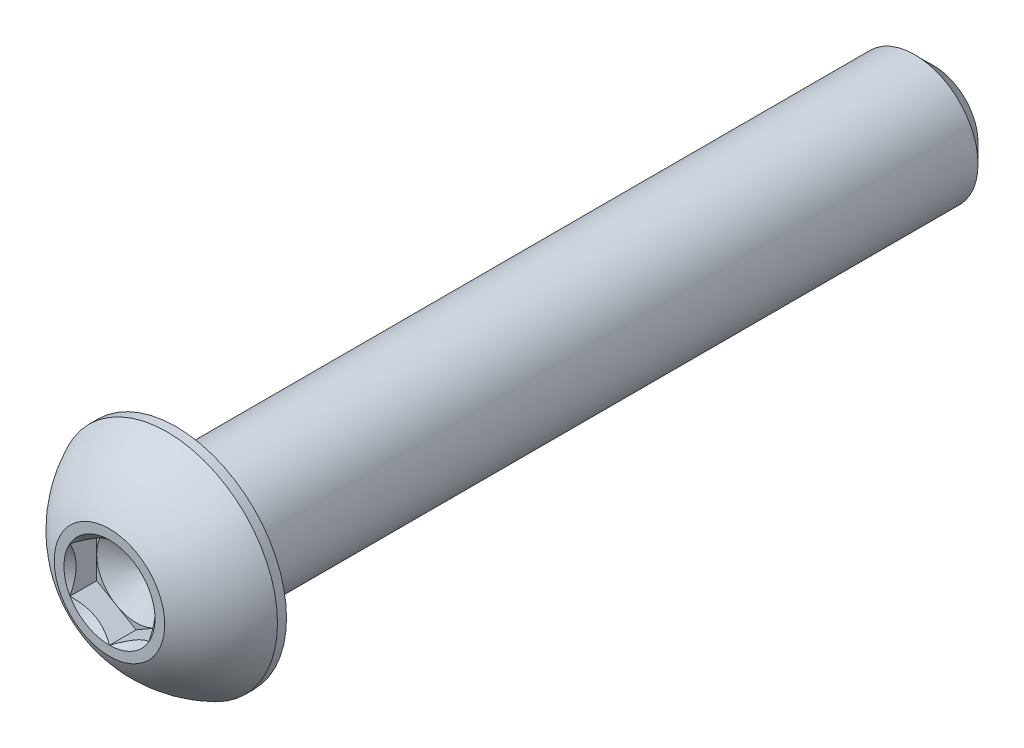
ISO-10303-21;
HEADER;
FILE_DESCRIPTION(('STEP AP214'),'2;1');
FILE_NAME('part.step','',(''),(''),'','','');
FILE_SCHEMA(('AUTOMOTIVE_DESIGN { 1 0 10303 214 1 1 1 1 }'));
ENDSEC;
DATA;
#1=APPLICATION_CONTEXT('core data for automotive mechanical design processes');
#2=APPLICATION_PROTOCOL_DEFINITION('international standard','automotive_design',2000,#1);
#3=PRODUCT_CONTEXT('',#1,'mechanical');
#4=PRODUCT('Part','Part','',(#3));
#5=PRODUCT_RELATED_PRODUCT_CATEGORY('part','',(#4));
#6=PRODUCT_DEFINITION_FORMATION('','',#4);
#7=PRODUCT_DEFINITION_CONTEXT('part definition',#1,'design');
#8=PRODUCT_DEFINITION('design','',#6,#7);
#9=PRODUCT_DEFINITION_SHAPE('','',#8);
#10=(LENGTH_UNIT() NAMED_UNIT(*) SI_UNIT(.MILLI.,.METRE.));
#11=(NAMED_UNIT(*) PLANE_ANGLE_UNIT() SI_UNIT($,.RADIAN.));
#12=(NAMED_UNIT(*) SI_UNIT($,.STERADIAN.) SOLID_ANGLE_UNIT());
#13=UNCERTAINTY_MEASURE_WITH_UNIT(LENGTH_MEASURE(1.E-05),#10,'distance_accuracy_value','');
#14=(GEOMETRIC_REPRESENTATION_CONTEXT(3) GLOBAL_UNCERTAINTY_ASSIGNED_CONTEXT((#13)) GLOBAL_UNIT_ASSIGNED_CONTEXT((#10,
#11,#12)) REPRESENTATION_CONTEXT('',''));
#15=CARTESIAN_POINT('',(0.,0.,0.));
#16=DIRECTION('',(0.,0.,1.));
#17=DIRECTION('',(1.,0.,0.));
#18=AXIS2_PLACEMENT_3D('',#15,#16,#17);
#19=CARTESIAN_POINT('',(0.,1.984375,20.7264));
#20=DIRECTION('',(0.,0.,-1.));
#21=DIRECTION('',(-1.,0.,0.));
#22=AXIS2_PLACEMENT_3D('',#19,#20,#21);
#23=PLANE('',#22);
#24=CARTESIAN_POINT('',(0.,0.,20.7264));
#25=DIRECTION('',(0.,0.,1.));
#26=DIRECTION('',(1.,0.,0.));
#27=AXIS2_PLACEMENT_3D('',#24,#25,#26);
#28=CIRCLE('',#27,2.778125);
#29=CARTESIAN_POINT('',(0.,2.778125,20.7264));
#30=VERTEX_POINT('',#29);
#31=EDGE_CURVE('E167',#30,#30,#28,.T.);
#32=ORIENTED_EDGE('',*,*,#31,.T.);
#33=EDGE_LOOP('',(#32));
#34=FACE_BOUND('',#33,.T.);
#35=CARTESIAN_POINT('',(0.,0.,20.7264));
#36=DIRECTION('',(0.,0.,1.));
#37=DIRECTION('',(1.,0.,0.));
#38=AXIS2_PLACEMENT_3D('',#35,#36,#37);
#39=CIRCLE('',#38,2.29135888084633);
#40=CARTESIAN_POINT('',(0.,2.29135888084633,20.7264));
#41=VERTEX_POINT('',#40);
#42=CARTESIAN_POINT('',(-1.984375,1.14567944042316,20.7264));
#43=VERTEX_POINT('',#42);
#44=EDGE_CURVE('E121',#41,#43,#39,.T.);
#45=ORIENTED_EDGE('',*,*,#44,.F.);
#46=CARTESIAN_POINT('',(0.,0.,20.7264));
#47=DIRECTION('',(0.,0.,1.));
#48=DIRECTION('',(1.,0.,0.));
#49=AXIS2_PLACEMENT_3D('',#46,#47,#48);
#50=CIRCLE('',#49,2.29135888084633);
#51=CARTESIAN_POINT('',(1.984375,1.14567944042316,20.7264));
#52=VERTEX_POINT('',#51);
#53=EDGE_CURVE('E106',#52,#41,#50,.T.);
#54=ORIENTED_EDGE('',*,*,#53,.F.);
#55=CARTESIAN_POINT('',(0.,0.,20.7264));
#56=DIRECTION('',(0.,0.,1.));
#57=DIRECTION('',(1.,0.,0.));
#58=AXIS2_PLACEMENT_3D('',#55,#56,#57);
#59=CIRCLE('',#58,2.29135888084633);
#60=CARTESIAN_POINT('',(1.984375,-1.14567944042316,20.7264));
#61=VERTEX_POINT('',#60);
#62=EDGE_CURVE('E117',#61,#52,#59,.T.);
#63=ORIENTED_EDGE('',*,*,#62,.F.);
#64=CARTESIAN_POINT('',(0.,0.,20.7264));
#65=DIRECTION('',(0.,0.,1.));
#66=DIRECTION('',(1.,0.,0.));
#67=AXIS2_PLACEMENT_3D('',#64,#65,#66);
#68=CIRCLE('',#67,2.29135888084633);
#69=CARTESIAN_POINT('',(0.,-2.29135888084633,20.7264));
#70=VERTEX_POINT('',#69);
#71=EDGE_CURVE('E138',#70,#61,#68,.T.);
#72=ORIENTED_EDGE('',*,*,#71,.F.);
#73=CARTESIAN_POINT('',(0.,0.,20.7264));
#74=DIRECTION('',(0.,0.,1.));
#75=DIRECTION('',(1.,0.,0.));
#76=AXIS2_PLACEMENT_3D('',#73,#74,#75);
#77=CIRCLE('',#76,2.29135888084633);
#78=CARTESIAN_POINT('',(-1.984375,-1.14567944042317,20.7264));
#79=VERTEX_POINT('',#78);
#80=EDGE_CURVE('E438',#79,#70,#77,.T.);
#81=ORIENTED_EDGE('',*,*,#80,.F.);
#82=CARTESIAN_POINT('',(0.,0.,20.7264));
#83=DIRECTION('',(0.,0.,1.));
#84=DIRECTION('',(1.,0.,0.));
#85=AXIS2_PLACEMENT_3D('',#82,#83,#84);
#86=CIRCLE('',#85,2.29135888084633);
#87=EDGE_CURVE('E447',#43,#79,#86,.T.);
#88=ORIENTED_EDGE('',*,*,#87,.F.);
#89=EDGE_LOOP('',(#45,#54,#63,#72,#81,#88));
#90=FACE_BOUND('',#89,.T.);
#91=ADVANCED_FACE('F33',(#34,#90),#23,.F.);
#92=CARTESIAN_POINT('',(0.,0.,-20.7264));
#93=DIRECTION('',(0.,0.,1.));
#94=DIRECTION('',(1.,0.,0.));
#95=AXIS2_PLACEMENT_3D('',#92,#93,#94);
#96=CONICAL_SURFACE('',#95,2.22250000000001,0.785398163397448);
#97=CARTESIAN_POINT('',(0.,0.,-19.7739));
#98=DIRECTION('',(0.,0.,1.));
#99=DIRECTION('',(1.,0.,0.));
#100=AXIS2_PLACEMENT_3D('',#97,#98,#99);
#101=CIRCLE('',#100,3.175);
#102=CARTESIAN_POINT('',(3.175,0.,-19.7739));
#103=VERTEX_POINT('',#102);
#104=EDGE_CURVE('E11',#103,#103,#101,.T.);
#105=ORIENTED_EDGE('',*,*,#104,.F.);
#106=EDGE_LOOP('',(#105));
#107=FACE_BOUND('',#106,.T.);
#108=CARTESIAN_POINT('',(0.,0.,-20.7264));
#109=DIRECTION('',(0.,0.,1.));
#110=DIRECTION('',(1.,0.,0.));
#111=AXIS2_PLACEMENT_3D('',#108,#109,#110);
#112=CIRCLE('',#111,2.22250000000001);
#113=CARTESIAN_POINT('',(2.22250000000001,0.,-20.7264));
#114=VERTEX_POINT('',#113);
#115=EDGE_CURVE('E160',#114,#114,#112,.T.);
#116=ORIENTED_EDGE('',*,*,#115,.T.);
#117=EDGE_LOOP('',(#116));
#118=FACE_BOUND('',#117,.T.);
#119=ADVANCED_FACE('F35',(#107,#118),#96,.T.);
#120=CARTESIAN_POINT('',(0.,0.,20.7264));
#121=DIRECTION('',(0.,0.,1.));
#122=DIRECTION('',(1.,0.,0.));
#123=AXIS2_PLACEMENT_3D('',#120,#121,#122);
#124=CYLINDRICAL_SURFACE('',#123,3.175);
#125=CARTESIAN_POINT('',(0.,0.,17.3736));
#126=DIRECTION('',(0.,0.,1.));
#127=DIRECTION('',(1.,0.,0.));
#128=AXIS2_PLACEMENT_3D('',#125,#126,#127);
#129=CIRCLE('',#128,3.175);
#130=CARTESIAN_POINT('',(3.175,0.,17.3736));
#131=VERTEX_POINT('',#130);
#132=EDGE_CURVE('E41',#131,#131,#129,.T.);
#133=ORIENTED_EDGE('',*,*,#132,.F.);
#134=EDGE_LOOP('',(#133));
#135=FACE_BOUND('',#134,.T.);
#136=ORIENTED_EDGE('',*,*,#104,.T.);
#137=EDGE_LOOP('',(#136));
#138=FACE_BOUND('',#137,.T.);
#139=ADVANCED_FACE('F181',(#135,#138),#124,.T.);
#140=CARTESIAN_POINT('',(0.,5.5499,17.3736));
#141=DIRECTION('',(0.,0.,1.));
#142=DIRECTION('',(1.,0.,0.));
#143=AXIS2_PLACEMENT_3D('',#140,#141,#142);
#144=PLANE('',#143);
#145=CARTESIAN_POINT('',(0.,0.,17.3736));
#146=DIRECTION('',(0.,0.,1.));
#147=DIRECTION('',(1.,0.,0.));
#148=AXIS2_PLACEMENT_3D('',#145,#146,#147);
#149=CIRCLE('',#148,5.5499);
#150=CARTESIAN_POINT('',(5.5499,0.,17.3736));
#151=VERTEX_POINT('',#150);
#152=EDGE_CURVE('E174',#151,#151,#149,.T.);
#153=ORIENTED_EDGE('',*,*,#152,.F.);
#154=EDGE_LOOP('',(#153));
#155=FACE_BOUND('',#154,.T.);
#156=ORIENTED_EDGE('',*,*,#132,.T.);
#157=EDGE_LOOP('',(#156));
#158=FACE_BOUND('',#157,.T.);
#159=ADVANCED_FACE('F179',(#155,#158),#144,.F.);
#160=CARTESIAN_POINT('',(0.,0.,20.7264));
#161=DIRECTION('',(0.,0.,1.));
#162=DIRECTION('',(1.,0.,0.));
#163=AXIS2_PLACEMENT_3D('',#160,#161,#162);
#164=CYLINDRICAL_SURFACE('',#163,5.5499);
#165=CARTESIAN_POINT('',(0.,0.,17.8271714285714));
#166=DIRECTION('',(0.,0.,1.));
#167=DIRECTION('',(1.,0.,0.));
#168=AXIS2_PLACEMENT_3D('',#165,#166,#167);
#169=CIRCLE('',#168,5.5499);
#170=CARTESIAN_POINT('',(0.,5.5499,17.8271714285714));
#171=VERTEX_POINT('',#170);
#172=EDGE_CURVE('E171',#171,#171,#169,.T.);
#173=ORIENTED_EDGE('',*,*,#172,.F.);
#174=EDGE_LOOP('',(#173));
#175=FACE_BOUND('',#174,.T.);
#176=ORIENTED_EDGE('',*,*,#152,.T.);
#177=EDGE_LOOP('',(#176));
#178=FACE_BOUND('',#177,.T.);
#179=ADVANCED_FACE('F200',(#175,#178),#164,.T.);
#180=CARTESIAN_POINT('',(0.,0.,15.2958282068545));
#181=DIRECTION('',(0.,0.,1.));
#182=DIRECTION('',(0.,1.,0.));
#183=AXIS2_PLACEMENT_3D('',#180,#181,#182);
#184=SPHERICAL_SURFACE('',#183,6.09992528775001);
#185=CARTESIAN_POINT('',(0.,2.778125,20.7264));
#186=CARTESIAN_POINT('',(0.,2.81602671338564,20.7070106477222));
#187=CARTESIAN_POINT('',(0.,2.85372537445918,20.6872243821891));
#188=CARTESIAN_POINT('',(0.,2.92870021164798,20.6468669699155));
#189=CARTESIAN_POINT('',(0.,2.96597638776324,20.6262958231749));
#190=CARTESIAN_POINT('',(0.,3.04008987470139,20.5843775937889));
#191=CARTESIAN_POINT('',(0.,3.07692718552427,20.5630305111435));
#192=CARTESIAN_POINT('',(0.,3.15014680356086,20.5195697876022));
#193=CARTESIAN_POINT('',(0.,3.18652911077458,20.4974561467063));
#194=CARTESIAN_POINT('',(0.,3.25882276944387,20.4524719956597));
#195=CARTESIAN_POINT('',(0.,3.29473412089945,20.429601485509));
#196=CARTESIAN_POINT('',(0.,3.36607012592493,20.3831136233654));
#197=CARTESIAN_POINT('',(0.,3.40149477949484,20.3594962713726));
#198=CARTESIAN_POINT('',(0.,3.47184185902622,20.3115250785858));
#199=CARTESIAN_POINT('',(0.,3.50676428498768,20.2871712377917));
#200=CARTESIAN_POINT('',(0.,3.57609160000261,20.2377377437818));
#201=CARTESIAN_POINT('',(0.,3.61049648905608,20.2126580905659));
#202=CARTESIAN_POINT('',(0.,3.67877364776563,20.1617839661473));
#203=CARTESIAN_POINT('',(0.,3.71264591742172,20.1359894949444));
#204=CARTESIAN_POINT('',(0.,3.77984298835613,20.0836970423841));
#205=CARTESIAN_POINT('',(0.,3.81316778963445,20.0571990610266));
#206=CARTESIAN_POINT('',(0.,3.87925531482814,20.0035112043859));
#207=CARTESIAN_POINT('',(0.,3.91201803874352,19.9763213291027));
#208=CARTESIAN_POINT('',(0.,3.97696704663191,19.9212616041558));
#209=CARTESIAN_POINT('',(0.,4.00915333060493,19.8933917544921));
#210=CARTESIAN_POINT('',(0.,4.07293534872958,19.8369842984171));
#211=CARTESIAN_POINT('',(0.,4.10453108288122,19.8084466920057));
#212=CARTESIAN_POINT('',(0.,4.16711815037044,19.7507162328008));
#213=CARTESIAN_POINT('',(0.,4.19810948370803,19.7215233800072));
#214=CARTESIAN_POINT('',(0.,4.25947416353471,19.6624952256512));
#215=CARTESIAN_POINT('',(0.,4.28984751002382,19.6326599240888));
#216=CARTESIAN_POINT('',(0.,4.34996290103328,19.5723599514462));
#217=CARTESIAN_POINT('',(0.,4.37970494555363,19.5418952803661));
#218=CARTESIAN_POINT('',(0.,4.43854469425657,19.4803499238436));
#219=CARTESIAN_POINT('',(0.,4.46764239843916,19.4492692384012));
#220=CARTESIAN_POINT('',(0.,4.52518071056457,19.3865054783587));
#221=CARTESIAN_POINT('',(0.,4.55362131850739,19.3548224037587));
#222=CARTESIAN_POINT('',(0.,4.60983297031029,19.2908677546821));
#223=CARTESIAN_POINT('',(0.,4.63760401417035,19.2585961802057));
#224=CARTESIAN_POINT('',(0.,4.6924643634894,19.193478678645));
#225=CARTESIAN_POINT('',(0.,4.71955366894838,19.1606327515608));
#226=CARTESIAN_POINT('',(0.,4.77303866600855,19.0943809438392));
#227=CARTESIAN_POINT('',(0.,4.79943435760973,19.0609750632017));
#228=CARTESIAN_POINT('',(0.,4.85152055556542,18.9936179929015));
#229=CARTESIAN_POINT('',(0.,4.87721106191991,18.9596668032387));
#230=CARTESIAN_POINT('',(0.,4.927875627133,18.8912339984688));
#231=CARTESIAN_POINT('',(0.,4.95284968599158,18.8567523833617));
#232=CARTESIAN_POINT('',(0.,5.00207040804361,18.7872738438145));
#233=CARTESIAN_POINT('',(0.,5.02631707123706,18.7522769193743));
#234=CARTESIAN_POINT('',(0.,5.0740723726572,18.6817831031697));
#235=CARTESIAN_POINT('',(0.,5.09758101088389,18.6462862114053));
#236=CARTESIAN_POINT('',(0.,5.1438499566405,18.5748080217543));
#237=CARTESIAN_POINT('',(0.,5.16661026417041,18.5388267238678));
#238=CARTESIAN_POINT('',(0.,5.21137257072764,18.4663954954669));
#239=CARTESIAN_POINT('',(0.,5.23337456975495,18.4299455649525));
#240=CARTESIAN_POINT('',(0.,5.276610614416,18.3565930504643));
#241=CARTESIAN_POINT('',(0.,5.29784466004975,18.3196904664905));
#242=CARTESIAN_POINT('',(0.,5.33953548787471,18.2454488218128));
#243=CARTESIAN_POINT('',(0.,5.35999227006592,18.208109761109));
#244=CARTESIAN_POINT('',(0.,5.40011960846765,18.133011534306));
#245=CARTESIAN_POINT('',(0.,5.41979016467818,18.0952523682069));
#246=CARTESIAN_POINT('',(0.,5.45833640797136,18.0193304739407));
#247=CARTESIAN_POINT('',(0.,5.47721209505402,17.9811677457736));
#248=CARTESIAN_POINT('',(0.,5.51416039973219,17.9044554930474));
#249=CARTESIAN_POINT('',(0.,5.53223301732771,17.8659059684884));
#250=CARTESIAN_POINT('',(0.,5.5499,17.8271714285714));
#251=B_SPLINE_CURVE_WITH_KNOTS('',3,(#185,#186,#187,#188,#189,#190,#191,#192,#193,#194,#195,
#196,#197,#198,#199,#200,#201,#202,#203,#204,#205,#206,#207,#208,#209,#210,#211,#212,#213,#214,
#215,#216,#217,#218,#219,#220,#221,#222,#223,#224,#225,#226,#227,#228,#229,#230,#231,#232,#233,
#234,#235,#236,#237,#238,#239,#240,#241,#242,#243,#244,#245,#246,#247,#248,#249,#250),
.UNSPECIFIED.,.F.,.F.,(4,2,2,2,2,2,2,2,2,2,2,2,2,2,2,2,2,2,2,2,2,2,2,2,2,2,2,2,2,2,2,2,4),(0.,
0.127717597491553,0.255435194983108,0.383152792474662,0.510870389966214,0.638587987457769,
0.766305584949325,0.894023182440877,1.02174077993243,1.14945837742399,1.27717597491554,
1.40489357240709,1.53261116989865,1.6603287673902,1.78804636488176,1.91576396237331,
2.04348155986486,2.17119915735642,2.29891675484797,2.42663435233952,2.55435194983108,
2.68206954732263,2.80978714481419,2.93750474230574,3.06522233979729,3.19293993728885,
3.3206575347804,3.44837513227195,3.57609272976351,3.70381032725506,3.83152792474662,
3.95924552223817,4.08696311972973),.UNSPECIFIED.);
#252=EDGE_CURVE('BSEAM192',#30,#171,#251,.T.);
#253=ORIENTED_EDGE('',*,*,#31,.F.);
#254=ORIENTED_EDGE('',*,*,#172,.T.);
#255=ORIENTED_EDGE('',*,*,#252,.T.);
#256=ORIENTED_EDGE('',*,*,#252,.F.);
#257=EDGE_LOOP('',(#253,#255,#254,#256));
#258=FACE_BOUND('',#257,.T.);
#259=ADVANCED_FACE('F192',(#258),#184,.T.);
#260=CARTESIAN_POINT('',(0.,2.22250000000001,-20.7264));
#261=DIRECTION('',(0.,0.,1.));
#262=DIRECTION('',(1.,0.,0.));
#263=AXIS2_PLACEMENT_3D('',#260,#261,#262);
#264=PLANE('',#263);
#265=ORIENTED_EDGE('',*,*,#115,.F.);
#266=EDGE_LOOP('',(#265));
#267=FACE_BOUND('',#266,.T.);
#268=ADVANCED_FACE('F190',(#267),#264,.F.);
#269=CARTESIAN_POINT('',(1.984375,1.14567944042316,20.7264));
#270=DIRECTION('',(-0.499999999999999,-0.866025403784439,0.));
#271=DIRECTION('',(0.866025403784439,-0.499999999999999,0.));
#272=AXIS2_PLACEMENT_3D('',#269,#270,#271);
#273=PLANE('',#272);
#274=CARTESIAN_POINT('',(1.984575,1.14556397036933,20.7265154787818));
#275=CARTESIAN_POINT('',(1.9163590048332,1.18494849354192,20.6871628522639));
#276=CARTESIAN_POINT('',(1.84700231489303,1.22499159714897,20.6501213104462));
#277=CARTESIAN_POINT('',(1.70557619954781,1.30664400291398,20.5822988584233));
#278=CARTESIAN_POINT('',(1.63349332126322,1.34826107209555,20.5515556890918));
#279=CARTESIAN_POINT('',(1.488141602734,1.43217992591557,20.4988918888112));
#280=CARTESIAN_POINT('',(1.41490978751306,1.47446033414662,20.47683887588));
#281=CARTESIAN_POINT('',(1.26683381740529,1.55995203534886,20.4428614929439));
#282=CARTESIAN_POINT('',(1.19199418724658,1.60316071596705,20.4309117560917));
#283=CARTESIAN_POINT('',(1.06301458545618,1.6776271237807,20.4201300990819));
#284=CARTESIAN_POINT('',(1.00904128422756,1.7087886237741,20.4185338990591));
#285=CARTESIAN_POINT('',(0.9011828814802,1.77106070163465,20.4212218388653));
#286=CARTESIAN_POINT('',(0.847297817514477,1.80217125782056,20.4255080403405));
#287=CARTESIAN_POINT('',(0.740036461751396,1.86409863044402,20.4397168730135));
#288=CARTESIAN_POINT('',(0.686660807239859,1.89491507894443,20.4496458104523));
#289=CARTESIAN_POINT('',(0.580832482591103,1.95601509066827,20.4745950842745));
#290=CARTESIAN_POINT('',(0.528379742028898,1.9862986945516,20.4896150303895));
#291=CARTESIAN_POINT('',(0.394017661036351,2.06387267818152,20.5342078516357));
#292=CARTESIAN_POINT('',(0.312941642841675,2.11068193911104,20.5671429959383));
#293=CARTESIAN_POINT('',(0.19372669327016,2.17951072233758,20.6227424412022));
#294=CARTESIAN_POINT('',(0.154440075613998,2.20219286161692,20.6422775920519));
#295=CARTESIAN_POINT('',(0.0765946381319459,2.24713694590237,20.6831287381194));
#296=CARTESIAN_POINT('',(0.0380353888982997,2.26939913882716,20.7044436395683));
#297=CARTESIAN_POINT('',(-0.00020000000000182,2.29147435090016,20.7265154787818));
#298=B_SPLINE_CURVE_WITH_KNOTS('',3,(#274,#275,#276,#277,#278,#279,#280,#281,#282,#283,#284,
#285,#286,#287,#288,#289,#290,#291,#292,#293,#294,#295,#296,#297),.UNSPECIFIED.,.F.,.F.,(4,2,2,
2,2,2,2,2,2,2,2,4),(0.,0.264339630306625,0.530219665093694,0.791876416371459,1.05287424418109,
1.239639843932,1.42647091743852,1.61351120244035,1.8005371524754,2.09764209964316,
2.24579179873713,2.39385111134157),.UNSPECIFIED.);
#299=EDGE_CURVE('E103',#52,#41,#298,.T.);
#300=ORIENTED_EDGE('',*,*,#299,.T.);
#301=DIRECTION('',(0.,0.,-1.));
#302=VECTOR('',#301,1.);
#303=CARTESIAN_POINT('',(0.,2.29135888084633,20.7264));
#304=LINE('',#303,#302);
#305=CARTESIAN_POINT('',(0.,2.29135888084633,19.38528));
#306=VERTEX_POINT('',#305);
#307=EDGE_CURVE('E158',#41,#306,#304,.T.);
#308=ORIENTED_EDGE('',*,*,#307,.T.);
#309=DIRECTION('',(-0.866025403784439,0.499999999999999,0.));
#310=VECTOR('',#309,1.);
#311=CARTESIAN_POINT('',(1.984375,1.14567944042316,19.38528));
#312=LINE('',#311,#310);
#313=CARTESIAN_POINT('',(0.992187499999999,1.71851916063475,19.38528));
#314=VERTEX_POINT('',#313);
#315=EDGE_CURVE('E474',#314,#306,#312,.T.);
#316=ORIENTED_EDGE('',*,*,#315,.F.);
#317=CARTESIAN_POINT('',(1.984375,1.14567944042316,19.38528));
#318=VERTEX_POINT('',#317);
#319=EDGE_CURVE('E48',#318,#314,#312,.T.);
#320=ORIENTED_EDGE('',*,*,#319,.F.);
#321=DIRECTION('',(0.,0.,-1.));
#322=VECTOR('',#321,1.);
#323=CARTESIAN_POINT('',(1.984375,1.14567944042316,20.7264));
#324=LINE('',#323,#322);
#325=EDGE_CURVE('E134',#52,#318,#324,.T.);
#326=ORIENTED_EDGE('',*,*,#325,.F.);
#327=EDGE_LOOP('',(#300,#308,#316,#320,#326));
#328=FACE_BOUND('',#327,.T.);
#329=ADVANCED_FACE('F140',(#328),#273,.T.);
#330=CARTESIAN_POINT('',(0.,2.29135888084633,20.7264));
#331=DIRECTION('',(0.5,-0.866025403784438,0.));
#332=DIRECTION('',(0.866025403784438,0.5,0.));
#333=AXIS2_PLACEMENT_3D('',#330,#331,#332);
#334=PLANE('',#333);
#335=CARTESIAN_POINT('',(0.000199999999998687,2.29147435090016,20.7265154787818));
#336=CARTESIAN_POINT('',(-0.0680159951668033,2.25208982772757,20.6871628522639));
#337=CARTESIAN_POINT('',(-0.137372685106966,2.21204672412052,20.6501213104462));
#338=CARTESIAN_POINT('',(-0.278798800452188,2.13039431835551,20.5822988584233));
#339=CARTESIAN_POINT('',(-0.350881678736783,2.08877724917394,20.5515556890918));
#340=CARTESIAN_POINT('',(-0.496233397266004,2.00485839535392,20.4988918888112));
#341=CARTESIAN_POINT('',(-0.569465212486938,1.96257798712287,20.47683887588));
#342=CARTESIAN_POINT('',(-0.717541182594705,1.87708628592063,20.4428614929439));
#343=CARTESIAN_POINT('',(-0.792380812753424,1.83387760530244,20.4309117560917));
#344=CARTESIAN_POINT('',(-0.921360414543815,1.75941119748879,20.4201300990819));
#345=CARTESIAN_POINT('',(-0.975333715772441,1.72824969749539,20.4185338990591));
#346=CARTESIAN_POINT('',(-1.0831921185198,1.66597761963484,20.4212218388653));
#347=CARTESIAN_POINT('',(-1.13707718248552,1.63486706344893,20.4255080403405));
#348=CARTESIAN_POINT('',(-1.2443385382486,1.57293969082547,20.4397168730135));
#349=CARTESIAN_POINT('',(-1.29771419276014,1.54212324232506,20.4496458104523));
#350=CARTESIAN_POINT('',(-1.4035425174089,1.48102323060122,20.4745950842745));
#351=CARTESIAN_POINT('',(-1.4559952579711,1.45073962671789,20.4896150303895));
#352=CARTESIAN_POINT('',(-1.59035733896365,1.37316564308797,20.5342078516357));
#353=CARTESIAN_POINT('',(-1.67143335715832,1.32635638215845,20.5671429959383));
#354=CARTESIAN_POINT('',(-1.79064830672984,1.25752759893191,20.6227424412022));
#355=CARTESIAN_POINT('',(-1.829934924386,1.23484545965257,20.6422775920519));
#356=CARTESIAN_POINT('',(-1.90778036186805,1.18990137536713,20.6831287381194));
#357=CARTESIAN_POINT('',(-1.9463396111017,1.16763918244233,20.7044436395683));
#358=CARTESIAN_POINT('',(-1.984575,1.14556397036932,20.7265154787818));
#359=B_SPLINE_CURVE_WITH_KNOTS('',3,(#335,#336,#337,#338,#339,#340,#341,#342,#343,#344,#345,
#346,#347,#348,#349,#350,#351,#352,#353,#354,#355,#356,#357,#358),.UNSPECIFIED.,.F.,.F.,(4,2,2,
2,2,2,2,2,2,2,2,4),(0.,0.264339630306626,0.530219665093693,0.791876416371457,1.05287424418109,
1.239639843932,1.42647091743852,1.61351120244034,1.8005371524754,2.09764209964316,
2.24579179873713,2.39385111134157),.UNSPECIFIED.);
#360=EDGE_CURVE('E462',#41,#43,#359,.T.);
#361=ORIENTED_EDGE('',*,*,#360,.T.);
#362=DIRECTION('',(0.,0.,-1.));
#363=VECTOR('',#362,1.);
#364=CARTESIAN_POINT('',(-1.984375,1.14567944042316,20.7264));
#365=LINE('',#364,#363);
#366=CARTESIAN_POINT('',(-1.984375,1.14567944042316,19.38528));
#367=VERTEX_POINT('',#366);
#368=EDGE_CURVE('E155',#43,#367,#365,.T.);
#369=ORIENTED_EDGE('',*,*,#368,.T.);
#370=DIRECTION('',(-0.866025403784438,-0.5,0.));
#371=VECTOR('',#370,1.);
#372=CARTESIAN_POINT('',(0.,2.29135888084633,19.38528));
#373=LINE('',#372,#371);
#374=CARTESIAN_POINT('',(-0.992187500000001,1.71851916063474,19.38528));
#375=VERTEX_POINT('',#374);
#376=EDGE_CURVE('E476',#375,#367,#373,.T.);
#377=ORIENTED_EDGE('',*,*,#376,.F.);
#378=EDGE_CURVE('E477',#306,#375,#373,.T.);
#379=ORIENTED_EDGE('',*,*,#378,.F.);
#380=ORIENTED_EDGE('',*,*,#307,.F.);
#381=EDGE_LOOP('',(#361,#369,#377,#379,#380));
#382=FACE_BOUND('',#381,.T.);
#383=ADVANCED_FACE('F198',(#382),#334,.T.);
#384=CARTESIAN_POINT('',(-1.984375,1.14567944042316,20.7264));
#385=DIRECTION('',(1.,0.,0.));
#386=DIRECTION('',(0.,0.,-1.));
#387=AXIS2_PLACEMENT_3D('',#384,#385,#386);
#388=PLANE('',#387);
#389=CARTESIAN_POINT('',(-1.984375,-2.24664989492636,21.4325700833169));
#390=CARTESIAN_POINT('',(-1.984375,-2.19177035879913,21.3914466992886));
#391=CARTESIAN_POINT('',(-1.984375,-2.1365793309425,21.3507329661326));
#392=CARTESIAN_POINT('',(-1.984375,-2.0254530694156,21.2703048670618));
#393=CARTESIAN_POINT('',(-1.984375,-1.96951764844329,21.2305907602265));
#394=CARTESIAN_POINT('',(-1.984375,-1.85637247000972,21.1520599960499));
#395=CARTESIAN_POINT('',(-1.984375,-1.79915619451492,21.1132526850202));
#396=CARTESIAN_POINT('',(-1.984375,-1.68374612486123,21.0371311665578));
#397=CARTESIAN_POINT('',(-1.984375,-1.62555240093273,20.9998168524981));
#398=CARTESIAN_POINT('',(-1.984375,-1.44283684202776,20.886567942359));
#399=CARTESIAN_POINT('',(-1.984375,-1.31636516124235,20.8137214191006));
#400=CARTESIAN_POINT('',(-1.984375,-1.05716498260296,20.6807117557777));
#401=CARTESIAN_POINT('',(-1.984375,-0.924459462264124,20.6205059196547));
#402=CARTESIAN_POINT('',(-1.984375,-0.724893074141589,20.5468618396154));
#403=CARTESIAN_POINT('',(-1.984375,-0.660907572248814,20.5256629174856));
#404=CARTESIAN_POINT('',(-1.984375,-0.531425551080249,20.4884071147974));
#405=CARTESIAN_POINT('',(-1.984375,-0.465928924835297,20.4723505994633));
#406=CARTESIAN_POINT('',(-1.984375,-0.334891945890407,20.4464708434592));
#407=CARTESIAN_POINT('',(-1.984375,-0.269372555502923,20.4365431015484));
#408=CARTESIAN_POINT('',(-1.984375,-0.137675185771463,20.4231085903106));
#409=CARTESIAN_POINT('',(-1.984375,-0.0714973135780651,20.4196007929468));
#410=CARTESIAN_POINT('',(-1.984375,0.0586431546448463,20.4192516482374));
#411=CARTESIAN_POINT('',(-1.984375,0.122605247687117,20.4221896245911));
#412=CARTESIAN_POINT('',(-1.984375,0.249962419599663,20.4340917091826));
#413=CARTESIAN_POINT('',(-1.984375,0.31335744162457,20.4430564148524));
#414=CARTESIAN_POINT('',(-1.984375,0.440194078343454,20.4666811503476));
#415=CARTESIAN_POINT('',(-1.984375,0.503617615772963,20.4814367997364));
#416=CARTESIAN_POINT('',(-1.984375,0.629083701047628,20.5158707574727));
#417=CARTESIAN_POINT('',(-1.984375,0.691126376772748,20.535548607898));
#418=CARTESIAN_POINT('',(-1.984375,0.888252191671362,20.6054251863326));
#419=CARTESIAN_POINT('',(-1.984375,1.02048040542614,20.6636555893404));
#420=CARTESIAN_POINT('',(-1.984375,1.27871806100267,20.7930691802767));
#421=CARTESIAN_POINT('',(-1.984375,1.40470281207756,20.8642992719574));
#422=CARTESIAN_POINT('',(-1.984375,1.5867785992022,20.9754129319412));
#423=CARTESIAN_POINT('',(-1.984375,1.64484387516129,21.0121238248926));
#424=CARTESIAN_POINT('',(-1.984375,1.75997827817988,21.0870874476375));
#425=CARTESIAN_POINT('',(-1.984375,1.81704732901584,21.1253402946748));
#426=CARTESIAN_POINT('',(-1.984375,1.92985499213403,21.2027867819938));
#427=CARTESIAN_POINT('',(-1.984375,1.98560066211377,21.2419701932287));
#428=CARTESIAN_POINT('',(-1.984375,2.09633159947626,21.3213666099261));
#429=CARTESIAN_POINT('',(-1.984375,2.15131707145808,21.3615793297131));
#430=CARTESIAN_POINT('',(-1.984375,2.20598450458982,21.40221347261));
#431=B_SPLINE_CURVE_WITH_KNOTS('',3,(#389,#390,#391,#392,#393,#394,#395,#396,#397,#398,#399,
#400,#401,#402,#403,#404,#405,#406,#407,#408,#409,#410,#411,#412,#413,#414,#415,#416,#417,#418,
#419,#420,#421,#422,#423,#424,#425,#426,#427,#428,#429,#430),.UNSPECIFIED.,.F.,.F.,(4,2,2,2,2,2,
2,2,2,2,2,2,2,2,2,2,2,2,2,2,4),(0.,0.205736210356765,0.41152520480981,0.618909845914799,
0.826279649489809,1.26374370453551,1.69970549535382,1.90175047418286,2.10380979948048,
2.3023211047986,2.50080061937433,2.69259135253523,2.88440110079442,3.07952109080018,
3.27462293514803,3.70679897011889,4.14056631296021,4.34663769336143,4.552724772271,
4.75712951108819,4.96147812147718),.UNSPECIFIED.);
#432=EDGE_CURVE('E455',#43,#79,#431,.F.);
#433=ORIENTED_EDGE('',*,*,#432,.T.);
#434=DIRECTION('',(0.,0.,-1.));
#435=VECTOR('',#434,1.);
#436=CARTESIAN_POINT('',(-1.984375,-1.14567944042316,20.7264));
#437=LINE('',#436,#435);
#438=CARTESIAN_POINT('',(-1.984375,-1.14567944042316,19.38528));
#439=VERTEX_POINT('',#438);
#440=EDGE_CURVE('E152',#79,#439,#437,.T.);
#441=ORIENTED_EDGE('',*,*,#440,.T.);
#442=DIRECTION('',(0.,-1.,0.));
#443=VECTOR('',#442,1.);
#444=CARTESIAN_POINT('',(-1.984375,1.14567944042316,19.38528));
#445=LINE('',#444,#443);
#446=CARTESIAN_POINT('',(-1.984375,0.,19.38528));
#447=VERTEX_POINT('',#446);
#448=EDGE_CURVE('E480',#447,#439,#445,.T.);
#449=ORIENTED_EDGE('',*,*,#448,.F.);
#450=EDGE_CURVE('E481',#367,#447,#445,.T.);
#451=ORIENTED_EDGE('',*,*,#450,.F.);
#452=ORIENTED_EDGE('',*,*,#368,.F.);
#453=EDGE_LOOP('',(#433,#441,#449,#451,#452));
#454=FACE_BOUND('',#453,.T.);
#455=ADVANCED_FACE('F319',(#454),#388,.T.);
#456=CARTESIAN_POINT('',(-1.984375,-1.14567944042316,20.7264));
#457=DIRECTION('',(0.499999999999999,0.866025403784439,0.));
#458=DIRECTION('',(-0.866025403784439,0.499999999999999,0.));
#459=AXIS2_PLACEMENT_3D('',#456,#457,#458);
#460=PLANE('',#459);
#461=CARTESIAN_POINT('',(-1.984575,-1.14556397036933,20.7265154787818));
#462=CARTESIAN_POINT('',(-1.9163590048332,-1.18494849354192,20.6871628522639));
#463=CARTESIAN_POINT('',(-1.84700231489303,-1.22499159714897,20.6501213104462));
#464=CARTESIAN_POINT('',(-1.70557619954781,-1.30664400291398,20.5822988584233));
#465=CARTESIAN_POINT('',(-1.63349332126322,-1.34826107209555,20.5515556890918));
#466=CARTESIAN_POINT('',(-1.488141602734,-1.43217992591557,20.4988918888112));
#467=CARTESIAN_POINT('',(-1.41490978751306,-1.47446033414663,20.47683887588));
#468=CARTESIAN_POINT('',(-1.26683381740529,-1.55995203534886,20.4428614929439));
#469=CARTESIAN_POINT('',(-1.19199418724658,-1.60316071596705,20.4309117560917));
#470=CARTESIAN_POINT('',(-1.06301458545619,-1.6776271237807,20.4201300990819));
#471=CARTESIAN_POINT('',(-1.00904128422756,-1.7087886237741,20.4185338990591));
#472=CARTESIAN_POINT('',(-0.901182881480202,-1.77106070163465,20.4212218388653));
#473=CARTESIAN_POINT('',(-0.847297817514479,-1.80217125782056,20.4255080403405));
#474=CARTESIAN_POINT('',(-0.740036461751398,-1.86409863044402,20.4397168730135));
#475=CARTESIAN_POINT('',(-0.686660807239861,-1.89491507894443,20.4496458104523));
#476=CARTESIAN_POINT('',(-0.580832482591105,-1.95601509066827,20.4745950842745));
#477=CARTESIAN_POINT('',(-0.5283797420289,-1.9862986945516,20.4896150303895));
#478=CARTESIAN_POINT('',(-0.394017661036353,-2.06387267818152,20.5342078516357));
#479=CARTESIAN_POINT('',(-0.312941642841677,-2.11068193911104,20.5671429959383));
#480=CARTESIAN_POINT('',(-0.193726693270161,-2.17951072233758,20.6227424412022));
#481=CARTESIAN_POINT('',(-0.154440075613999,-2.20219286161692,20.6422775920519));
#482=CARTESIAN_POINT('',(-0.0765946381319462,-2.24713694590237,20.6831287381194));
#483=CARTESIAN_POINT('',(-0.0380353888982999,-2.26939913882716,20.7044436395683));
#484=CARTESIAN_POINT('',(0.000200000000001473,-2.29147435090017,20.7265154787818));
#485=B_SPLINE_CURVE_WITH_KNOTS('',3,(#461,#462,#463,#464,#465,#466,#467,#468,#469,#470,#471,
#472,#473,#474,#475,#476,#477,#478,#479,#480,#481,#482,#483,#484),.UNSPECIFIED.,.F.,.F.,(4,2,2,
2,2,2,2,2,2,2,2,4),(0.,0.264339630306628,0.530219665093695,0.791876416371459,1.05287424418109,
1.239639843932,1.42647091743852,1.61351120244034,1.8005371524754,2.09764209964316,
2.24579179873713,2.39385111134157),.UNSPECIFIED.);
#486=EDGE_CURVE('E440',#79,#70,#485,.T.);
#487=ORIENTED_EDGE('',*,*,#486,.T.);
#488=DIRECTION('',(0.,0.,-1.));
#489=VECTOR('',#488,1.);
#490=CARTESIAN_POINT('',(0.,-2.29135888084633,20.7264));
#491=LINE('',#490,#489);
#492=CARTESIAN_POINT('',(0.,-2.29135888084633,19.38528));
#493=VERTEX_POINT('',#492);
#494=EDGE_CURVE('E143',#70,#493,#491,.T.);
#495=ORIENTED_EDGE('',*,*,#494,.T.);
#496=DIRECTION('',(0.866025403784439,-0.499999999999999,0.));
#497=VECTOR('',#496,1.);
#498=CARTESIAN_POINT('',(-1.984375,-1.14567944042316,19.38528));
#499=LINE('',#498,#497);
#500=CARTESIAN_POINT('',(-0.992187499999999,-1.71851916063475,19.38528));
#501=VERTEX_POINT('',#500);
#502=EDGE_CURVE('E484',#501,#493,#499,.T.);
#503=ORIENTED_EDGE('',*,*,#502,.F.);
#504=EDGE_CURVE('E485',#439,#501,#499,.T.);
#505=ORIENTED_EDGE('',*,*,#504,.F.);
#506=ORIENTED_EDGE('',*,*,#440,.F.);
#507=EDGE_LOOP('',(#487,#495,#503,#505,#506));
#508=FACE_BOUND('',#507,.T.);
#509=ADVANCED_FACE('F329',(#508),#460,.T.);
#510=CARTESIAN_POINT('',(0.,-2.29135888084633,20.7264));
#511=DIRECTION('',(-0.5,0.866025403784438,0.));
#512=DIRECTION('',(-0.866025403784438,-0.5,0.));
#513=AXIS2_PLACEMENT_3D('',#510,#511,#512);
#514=PLANE('',#513);
#515=CARTESIAN_POINT('',(-0.000199999999998304,-2.29147435090016,20.7265154787818));
#516=CARTESIAN_POINT('',(0.0680159951668038,-2.25208982772757,20.6871628522639));
#517=CARTESIAN_POINT('',(0.137372685106967,-2.21204672412052,20.6501213104462));
#518=CARTESIAN_POINT('',(0.278798800452188,-2.13039431835551,20.5822988584233));
#519=CARTESIAN_POINT('',(0.350881678736783,-2.08877724917394,20.5515556890918));
#520=CARTESIAN_POINT('',(0.496233397266004,-2.00485839535392,20.4988918888112));
#521=CARTESIAN_POINT('',(0.569465212486938,-1.96257798712287,20.47683887588));
#522=CARTESIAN_POINT('',(0.717541182594705,-1.87708628592063,20.4428614929439));
#523=CARTESIAN_POINT('',(0.792380812753423,-1.83387760530244,20.4309117560917));
#524=CARTESIAN_POINT('',(0.921360414543814,-1.75941119748879,20.4201300990819));
#525=CARTESIAN_POINT('',(0.975333715772441,-1.72824969749539,20.4185338990591));
#526=CARTESIAN_POINT('',(1.0831921185198,-1.66597761963484,20.4212218388653));
#527=CARTESIAN_POINT('',(1.13707718248552,-1.63486706344893,20.4255080403405));
#528=CARTESIAN_POINT('',(1.2443385382486,-1.57293969082547,20.4397168730135));
#529=CARTESIAN_POINT('',(1.29771419276014,-1.54212324232506,20.4496458104523));
#530=CARTESIAN_POINT('',(1.4035425174089,-1.48102323060122,20.4745950842745));
#531=CARTESIAN_POINT('',(1.4559952579711,-1.45073962671789,20.4896150303895));
#532=CARTESIAN_POINT('',(1.59035733896365,-1.37316564308797,20.5342078516357));
#533=CARTESIAN_POINT('',(1.67143335715832,-1.32635638215845,20.5671429959383));
#534=CARTESIAN_POINT('',(1.79064830672984,-1.25752759893191,20.6227424412022));
#535=CARTESIAN_POINT('',(1.829934924386,-1.23484545965257,20.6422775920519));
#536=CARTESIAN_POINT('',(1.90778036186805,-1.18990137536713,20.6831287381194));
#537=CARTESIAN_POINT('',(1.9463396111017,-1.16763918244233,20.7044436395683));
#538=CARTESIAN_POINT('',(1.984575,-1.14556397036933,20.7265154787818));
#539=B_SPLINE_CURVE_WITH_KNOTS('',3,(#515,#516,#517,#518,#519,#520,#521,#522,#523,#524,#525,
#526,#527,#528,#529,#530,#531,#532,#533,#534,#535,#536,#537,#538),.UNSPECIFIED.,.F.,.F.,(4,2,2,
2,2,2,2,2,2,2,2,4),(0.,0.264339630306626,0.530219665093693,0.791876416371457,1.05287424418109,
1.239639843932,1.42647091743852,1.61351120244034,1.8005371524754,2.09764209964316,
2.24579179873713,2.39385111134157),.UNSPECIFIED.);
#540=EDGE_CURVE('E431',#70,#61,#539,.T.);
#541=ORIENTED_EDGE('',*,*,#540,.T.);
#542=DIRECTION('',(0.,0.,-1.));
#543=VECTOR('',#542,1.);
#544=CARTESIAN_POINT('',(1.984375,-1.14567944042316,20.7264));
#545=LINE('',#544,#543);
#546=CARTESIAN_POINT('',(1.984375,-1.14567944042316,19.38528));
#547=VERTEX_POINT('',#546);
#548=EDGE_CURVE('E137',#61,#547,#545,.T.);
#549=ORIENTED_EDGE('',*,*,#548,.T.);
#550=DIRECTION('',(0.866025403784438,0.5,0.));
#551=VECTOR('',#550,1.);
#552=CARTESIAN_POINT('',(0.,-2.29135888084633,19.38528));
#553=LINE('',#552,#551);
#554=CARTESIAN_POINT('',(0.992187500000001,-1.71851916063475,19.38528));
#555=VERTEX_POINT('',#554);
#556=EDGE_CURVE('E487',#555,#547,#553,.T.);
#557=ORIENTED_EDGE('',*,*,#556,.F.);
#558=EDGE_CURVE('E488',#493,#555,#553,.T.);
#559=ORIENTED_EDGE('',*,*,#558,.F.);
#560=ORIENTED_EDGE('',*,*,#494,.F.);
#561=EDGE_LOOP('',(#541,#549,#557,#559,#560));
#562=FACE_BOUND('',#561,.T.);
#563=ADVANCED_FACE('F339',(#562),#514,.T.);
#564=CARTESIAN_POINT('',(1.984375,-1.14567944042316,20.7264));
#565=DIRECTION('',(-1.,0.,0.));
#566=DIRECTION('',(0.,-1.,0.));
#567=AXIS2_PLACEMENT_3D('',#564,#565,#566);
#568=PLANE('',#567);
#569=CARTESIAN_POINT('',(1.984375,-2.24664989492636,21.4325700833169));
#570=CARTESIAN_POINT('',(1.984375,-2.19177035879913,21.3914466992886));
#571=CARTESIAN_POINT('',(1.984375,-2.1365793309425,21.3507329661326));
#572=CARTESIAN_POINT('',(1.984375,-2.0254530694156,21.2703048670618));
#573=CARTESIAN_POINT('',(1.984375,-1.96951764844329,21.2305907602265));
#574=CARTESIAN_POINT('',(1.984375,-1.85637247000972,21.1520599960499));
#575=CARTESIAN_POINT('',(1.984375,-1.79915619451491,21.1132526850202));
#576=CARTESIAN_POINT('',(1.984375,-1.68374612486123,21.0371311665578));
#577=CARTESIAN_POINT('',(1.984375,-1.62555240093273,20.9998168524981));
#578=CARTESIAN_POINT('',(1.984375,-1.44283684202776,20.886567942359));
#579=CARTESIAN_POINT('',(1.984375,-1.31636516124235,20.8137214191006));
#580=CARTESIAN_POINT('',(1.984375,-1.05716498260296,20.6807117557777));
#581=CARTESIAN_POINT('',(1.984375,-0.924459462264122,20.6205059196547));
#582=CARTESIAN_POINT('',(1.984375,-0.724893074141588,20.5468618396154));
#583=CARTESIAN_POINT('',(1.984375,-0.660907572248813,20.5256629174856));
#584=CARTESIAN_POINT('',(1.984375,-0.531425551080248,20.4884071147974));
#585=CARTESIAN_POINT('',(1.984375,-0.465928924835295,20.4723505994633));
#586=CARTESIAN_POINT('',(1.984375,-0.334891945890406,20.4464708434592));
#587=CARTESIAN_POINT('',(1.984375,-0.269372555502922,20.4365431015484));
#588=CARTESIAN_POINT('',(1.984375,-0.137675185771462,20.4231085903106));
#589=CARTESIAN_POINT('',(1.984375,-0.0714973135780638,20.4196007929468));
#590=CARTESIAN_POINT('',(1.984375,0.0586431546448477,20.4192516482374));
#591=CARTESIAN_POINT('',(1.984375,0.122605247687118,20.4221896245911));
#592=CARTESIAN_POINT('',(1.984375,0.249962419599664,20.4340917091826));
#593=CARTESIAN_POINT('',(1.984375,0.313357441624571,20.4430564148524));
#594=CARTESIAN_POINT('',(1.984375,0.440194078343455,20.4666811503476));
#595=CARTESIAN_POINT('',(1.984375,0.503617615772965,20.4814367997364));
#596=CARTESIAN_POINT('',(1.984375,0.629083701047629,20.5158707574727));
#597=CARTESIAN_POINT('',(1.984375,0.691126376772749,20.535548607898));
#598=CARTESIAN_POINT('',(1.984375,0.888252191671364,20.6054251863326));
#599=CARTESIAN_POINT('',(1.984375,1.02048040542615,20.6636555893404));
#600=CARTESIAN_POINT('',(1.984375,1.27871806100267,20.7930691802767));
#601=CARTESIAN_POINT('',(1.984375,1.40470281207756,20.8642992719575));
#602=CARTESIAN_POINT('',(1.984375,1.5867785992022,20.9754129319412));
#603=CARTESIAN_POINT('',(1.984375,1.64484387516129,21.0121238248926));
#604=CARTESIAN_POINT('',(1.984375,1.75997827817989,21.0870874476375));
#605=CARTESIAN_POINT('',(1.984375,1.81704732901584,21.1253402946748));
#606=CARTESIAN_POINT('',(1.984375,1.92985499213404,21.2027867819938));
#607=CARTESIAN_POINT('',(1.984375,1.98560066211378,21.2419701932287));
#608=CARTESIAN_POINT('',(1.984375,2.09633159947627,21.3213666099261));
#609=CARTESIAN_POINT('',(1.984375,2.15131707145809,21.3615793297131));
#610=CARTESIAN_POINT('',(1.984375,2.20598450458983,21.40221347261));
#611=B_SPLINE_CURVE_WITH_KNOTS('',3,(#569,#570,#571,#572,#573,#574,#575,#576,#577,#578,#579,
#580,#581,#582,#583,#584,#585,#586,#587,#588,#589,#590,#591,#592,#593,#594,#595,#596,#597,#598,
#599,#600,#601,#602,#603,#604,#605,#606,#607,#608,#609,#610),.UNSPECIFIED.,.F.,.F.,(4,2,2,2,2,2,
2,2,2,2,2,2,2,2,2,2,2,2,2,2,4),(0.,0.205736210356764,0.411525204809809,0.618909845914797,
0.826279649489809,1.26374370453551,1.69970549535382,1.90175047418286,2.10380979948048,
2.3023211047986,2.50080061937433,2.69259135253523,2.88440110079442,3.07952109080018,
3.27462293514803,3.70679897011889,4.14056631296021,4.34663769336143,4.55272477227101,
4.7571295110882,4.96147812147718),.UNSPECIFIED.);
#612=EDGE_CURVE('E127',#61,#52,#611,.T.);
#613=ORIENTED_EDGE('',*,*,#612,.T.);
#614=ORIENTED_EDGE('',*,*,#325,.T.);
#615=DIRECTION('',(0.,1.,0.));
#616=VECTOR('',#615,1.);
#617=CARTESIAN_POINT('',(1.984375,-1.14567944042316,19.38528));
#618=LINE('',#617,#616);
#619=CARTESIAN_POINT('',(1.984375,0.,19.38528));
#620=VERTEX_POINT('',#619);
#621=EDGE_CURVE('E146',#620,#318,#618,.T.);
#622=ORIENTED_EDGE('',*,*,#621,.F.);
#623=EDGE_CURVE('E141',#547,#620,#618,.T.);
#624=ORIENTED_EDGE('',*,*,#623,.F.);
#625=ORIENTED_EDGE('',*,*,#548,.F.);
#626=EDGE_LOOP('',(#613,#614,#622,#624,#625));
#627=FACE_BOUND('',#626,.T.);
#628=ADVANCED_FACE('F132',(#627),#568,.T.);
#629=CARTESIAN_POINT('',(0.,0.,19.38528));
#630=DIRECTION('',(0.,0.,1.));
#631=DIRECTION('',(1.,0.,0.));
#632=AXIS2_PLACEMENT_3D('',#629,#630,#631);
#633=PLANE('',#632);
#634=CARTESIAN_POINT('',(0.,0.,19.38528));
#635=DIRECTION('',(0.,0.,1.));
#636=DIRECTION('',(1.,0.,0.));
#637=AXIS2_PLACEMENT_3D('',#634,#635,#636);
#638=CIRCLE('',#637,1.984375);
#639=EDGE_CURVE('E163',#555,#620,#638,.T.);
#640=ORIENTED_EDGE('',*,*,#639,.F.);
#641=ORIENTED_EDGE('',*,*,#556,.T.);
#642=ORIENTED_EDGE('',*,*,#623,.T.);
#643=EDGE_LOOP('',(#640,#641,#642));
#644=FACE_BOUND('',#643,.T.);
#645=ADVANCED_FACE('F241',(#644),#633,.T.);
#646=EDGE_CURVE('E500',#501,#555,#638,.T.);
#647=ORIENTED_EDGE('',*,*,#646,.F.);
#648=ORIENTED_EDGE('',*,*,#502,.T.);
#649=ORIENTED_EDGE('',*,*,#558,.T.);
#650=EDGE_LOOP('',(#647,#648,#649));
#651=FACE_BOUND('',#650,.T.);
#652=ADVANCED_FACE('F246',(#651),#633,.T.);
#653=EDGE_CURVE('E501',#447,#501,#638,.T.);
#654=ORIENTED_EDGE('',*,*,#653,.F.);
#655=ORIENTED_EDGE('',*,*,#448,.T.);
#656=ORIENTED_EDGE('',*,*,#504,.T.);
#657=EDGE_LOOP('',(#654,#655,#656));
#658=FACE_BOUND('',#657,.T.);
#659=ADVANCED_FACE('F259',(#658),#633,.T.);
#660=EDGE_CURVE('E502',#375,#447,#638,.T.);
#661=ORIENTED_EDGE('',*,*,#660,.F.);
#662=ORIENTED_EDGE('',*,*,#376,.T.);
#663=ORIENTED_EDGE('',*,*,#450,.T.);
#664=EDGE_LOOP('',(#661,#662,#663));
#665=FACE_BOUND('',#664,.T.);
#666=ADVANCED_FACE('F268',(#665),#633,.T.);
#667=EDGE_CURVE('E168',#314,#375,#638,.T.);
#668=ORIENTED_EDGE('',*,*,#667,.F.);
#669=ORIENTED_EDGE('',*,*,#315,.T.);
#670=ORIENTED_EDGE('',*,*,#378,.T.);
#671=EDGE_LOOP('',(#668,#669,#670));
#672=FACE_BOUND('',#671,.T.);
#673=ADVANCED_FACE('F277',(#672),#633,.T.);
#674=EDGE_CURVE('E164',#620,#314,#638,.T.);
#675=ORIENTED_EDGE('',*,*,#674,.F.);
#676=ORIENTED_EDGE('',*,*,#621,.T.);
#677=ORIENTED_EDGE('',*,*,#319,.T.);
#678=EDGE_LOOP('',(#675,#676,#677));
#679=FACE_BOUND('',#678,.T.);
#680=ADVANCED_FACE('F249',(#679),#633,.T.);
#681=CARTESIAN_POINT('',(0.,0.,19.38528));
#682=DIRECTION('',(0.,0.,1.));
#683=DIRECTION('',(1.,0.,0.));
#684=AXIS2_PLACEMENT_3D('',#681,#682,#683);
#685=CONICAL_SURFACE('',#684,1.984375,1.0471975511966);
#686=CARTESIAN_POINT('',(0.,0.,18.2396005595768));
#687=VERTEX_POINT('',#686);
#688=VERTEX_LOOP('',#687);
#689=FACE_BOUND('',#688,.T.);
#690=ORIENTED_EDGE('',*,*,#674,.T.);
#691=ORIENTED_EDGE('',*,*,#667,.T.);
#692=ORIENTED_EDGE('',*,*,#660,.T.);
#693=ORIENTED_EDGE('',*,*,#653,.T.);
#694=ORIENTED_EDGE('',*,*,#646,.T.);
#695=ORIENTED_EDGE('',*,*,#639,.T.);
#696=EDGE_LOOP('',(#690,#691,#692,#693,#694,#695));
#697=FACE_BOUND('',#696,.T.);
#698=ADVANCED_FACE('F209',(#689,#697),#685,.F.);
#699=CARTESIAN_POINT('',(0.,0.,20.7264));
#700=DIRECTION('',(0.,0.,1.));
#701=DIRECTION('',(1.,0.,0.));
#702=AXIS2_PLACEMENT_3D('',#699,#700,#701);
#703=CONICAL_SURFACE('',#702,2.29135888084633,0.78539816339745);
#704=ORIENTED_EDGE('',*,*,#44,.T.);
#705=ORIENTED_EDGE('',*,*,#360,.F.);
#706=EDGE_LOOP('',(#704,#705));
#707=FACE_BOUND('',#706,.T.);
#708=ADVANCED_FACE('F300',(#707),#703,.F.);
#709=CARTESIAN_POINT('',(0.,0.,20.7264));
#710=DIRECTION('',(0.,0.,1.));
#711=DIRECTION('',(1.,0.,0.));
#712=AXIS2_PLACEMENT_3D('',#709,#710,#711);
#713=CONICAL_SURFACE('',#712,2.29135888084633,0.78539816339745);
#714=ORIENTED_EDGE('',*,*,#87,.T.);
#715=ORIENTED_EDGE('',*,*,#432,.F.);
#716=EDGE_LOOP('',(#714,#715));
#717=FACE_BOUND('',#716,.T.);
#718=ADVANCED_FACE('F362',(#717),#713,.F.);
#719=CARTESIAN_POINT('',(0.,0.,20.7264));
#720=DIRECTION('',(0.,0.,1.));
#721=DIRECTION('',(1.,0.,0.));
#722=AXIS2_PLACEMENT_3D('',#719,#720,#721);
#723=CONICAL_SURFACE('',#722,2.29135888084633,0.78539816339745);
#724=ORIENTED_EDGE('',*,*,#80,.T.);
#725=ORIENTED_EDGE('',*,*,#486,.F.);
#726=EDGE_LOOP('',(#724,#725));
#727=FACE_BOUND('',#726,.T.);
#728=ADVANCED_FACE('F372',(#727),#723,.F.);
#729=CARTESIAN_POINT('',(0.,0.,20.7264));
#730=DIRECTION('',(0.,0.,1.));
#731=DIRECTION('',(1.,0.,0.));
#732=AXIS2_PLACEMENT_3D('',#729,#730,#731);
#733=CONICAL_SURFACE('',#732,2.29135888084633,0.78539816339745);
#734=ORIENTED_EDGE('',*,*,#71,.T.);
#735=ORIENTED_EDGE('',*,*,#540,.F.);
#736=EDGE_LOOP('',(#734,#735));
#737=FACE_BOUND('',#736,.T.);
#738=ADVANCED_FACE('F382',(#737),#733,.F.);
#739=CARTESIAN_POINT('',(0.,0.,20.7264));
#740=DIRECTION('',(0.,0.,1.));
#741=DIRECTION('',(1.,0.,0.));
#742=AXIS2_PLACEMENT_3D('',#739,#740,#741);
#743=CONICAL_SURFACE('',#742,2.29135888084633,0.78539816339745);
#744=ORIENTED_EDGE('',*,*,#62,.T.);
#745=ORIENTED_EDGE('',*,*,#612,.F.);
#746=EDGE_LOOP('',(#744,#745));
#747=FACE_BOUND('',#746,.T.);
#748=ADVANCED_FACE('F126',(#747),#743,.F.);
#749=CARTESIAN_POINT('',(0.,0.,20.7264));
#750=DIRECTION('',(0.,0.,1.));
#751=DIRECTION('',(1.,0.,0.));
#752=AXIS2_PLACEMENT_3D('',#749,#750,#751);
#753=CONICAL_SURFACE('',#752,2.29135888084633,0.78539816339745);
#754=ORIENTED_EDGE('',*,*,#53,.T.);
#755=ORIENTED_EDGE('',*,*,#299,.F.);
#756=EDGE_LOOP('',(#754,#755));
#757=FACE_BOUND('',#756,.T.);
#758=ADVANCED_FACE('F105',(#757),#753,.F.);
#759=CLOSED_SHELL('',(#91,#119,#139,#159,#179,#259,#268,#329,#383,#455,#509,#563,#628,#645,#652,
#659,#666,#673,#680,#698,#708,#718,#728,#738,#748,#758));
#760=MANIFOLD_SOLID_BREP('B2',#759);
#761=ADVANCED_BREP_SHAPE_REPRESENTATION('',(#18,#760),#14);
#762=SHAPE_DEFINITION_REPRESENTATION(#9,#761);
ENDSEC;
END-ISO-10303-21;
